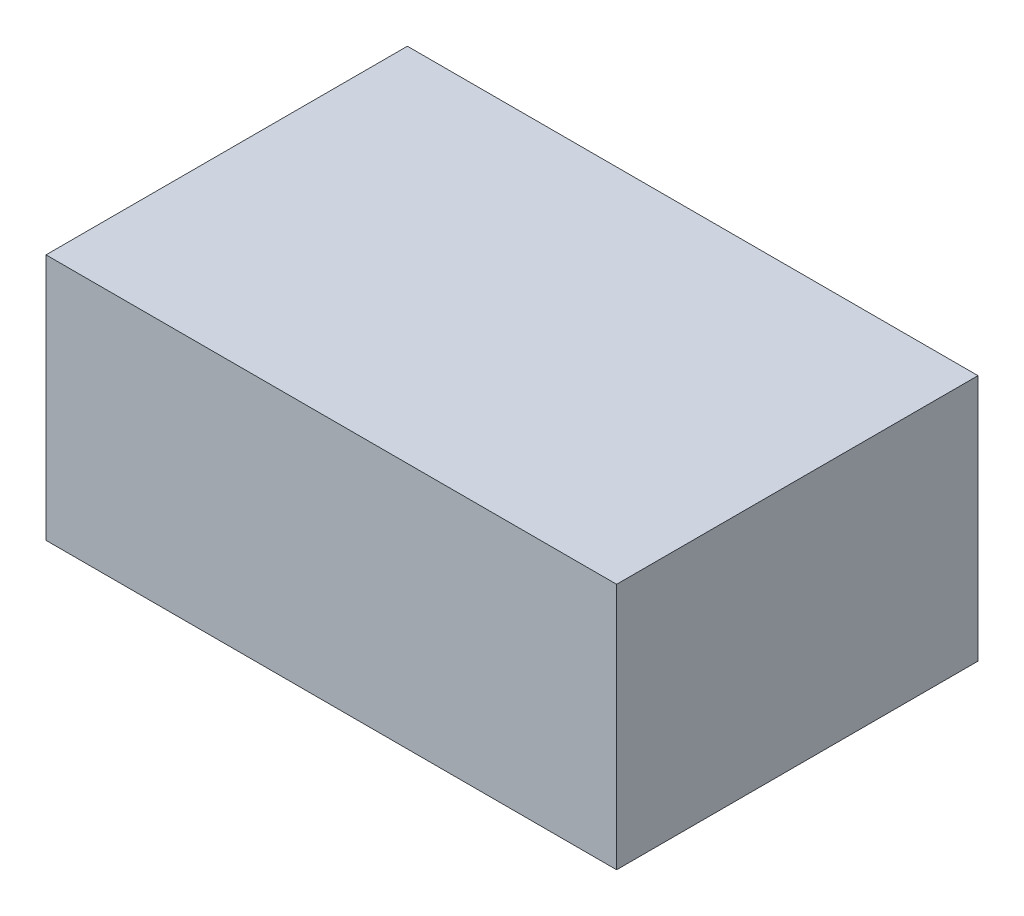
ISO-10303-21;
HEADER;
FILE_DESCRIPTION(('STEP AP214'),'2;1');
FILE_NAME('part.step','',(''),(''),'','','');
FILE_SCHEMA(('AUTOMOTIVE_DESIGN { 1 0 10303 214 1 1 1 1 }'));
ENDSEC;
DATA;
#1=APPLICATION_CONTEXT('core data for automotive mechanical design processes');
#2=APPLICATION_PROTOCOL_DEFINITION('international standard','automotive_design',2000,#1);
#3=PRODUCT_CONTEXT('',#1,'mechanical');
#4=PRODUCT('Part','Part','',(#3));
#5=PRODUCT_RELATED_PRODUCT_CATEGORY('part','',(#4));
#6=PRODUCT_DEFINITION_FORMATION('','',#4);
#7=PRODUCT_DEFINITION_CONTEXT('part definition',#1,'design');
#8=PRODUCT_DEFINITION('design','',#6,#7);
#9=PRODUCT_DEFINITION_SHAPE('','',#8);
#10=(LENGTH_UNIT() NAMED_UNIT(*) SI_UNIT(.MILLI.,.METRE.));
#11=(NAMED_UNIT(*) PLANE_ANGLE_UNIT() SI_UNIT($,.RADIAN.));
#12=(NAMED_UNIT(*) SI_UNIT($,.STERADIAN.) SOLID_ANGLE_UNIT());
#13=UNCERTAINTY_MEASURE_WITH_UNIT(LENGTH_MEASURE(1.E-05),#10,'distance_accuracy_value','');
#14=(GEOMETRIC_REPRESENTATION_CONTEXT(3) GLOBAL_UNCERTAINTY_ASSIGNED_CONTEXT((#13)) GLOBAL_UNIT_ASSIGNED_CONTEXT((#10,
#11,#12)) REPRESENTATION_CONTEXT('',''));
#15=CARTESIAN_POINT('',(0.,0.,0.));
#16=DIRECTION('',(0.,0.,1.));
#17=DIRECTION('',(1.,0.,0.));
#18=AXIS2_PLACEMENT_3D('',#15,#16,#17);
#19=CARTESIAN_POINT('',(-75.,32.5,0.));
#20=DIRECTION('',(0.,0.,1.));
#21=DIRECTION('',(1.,0.,0.));
#22=AXIS2_PLACEMENT_3D('',#19,#20,#21);
#23=PLANE('',#22);
#24=DIRECTION('',(1.,0.,0.));
#25=VECTOR('',#24,1.);
#26=CARTESIAN_POINT('',(-59.,-25.5,0.));
#27=LINE('',#26,#25);
#28=CARTESIAN_POINT('',(-60.,-25.5,0.));
#29=VERTEX_POINT('',#28);
#30=CARTESIAN_POINT('',(-59.,-25.5,0.));
#31=VERTEX_POINT('',#30);
#32=EDGE_CURVE('E165',#29,#31,#27,.T.);
#33=ORIENTED_EDGE('',*,*,#32,.T.);
#34=DIRECTION('',(0.,1.,0.));
#35=VECTOR('',#34,1.);
#36=CARTESIAN_POINT('',(-59.,-25.5,0.));
#37=LINE('',#36,#35);
#38=CARTESIAN_POINT('',(-59.,-18.5,0.));
#39=VERTEX_POINT('',#38);
#40=EDGE_CURVE('E50',#31,#39,#37,.T.);
#41=ORIENTED_EDGE('',*,*,#40,.T.);
#42=DIRECTION('',(-1.,0.,0.));
#43=VECTOR('',#42,1.);
#44=CARTESIAN_POINT('',(-59.,-18.5,0.));
#45=LINE('',#44,#43);
#46=CARTESIAN_POINT('',(-60.,-18.5,0.));
#47=VERTEX_POINT('',#46);
#48=EDGE_CURVE('E171',#39,#47,#45,.T.);
#49=ORIENTED_EDGE('',*,*,#48,.T.);
#50=DIRECTION('',(0.,-1.,0.));
#51=VECTOR('',#50,1.);
#52=CARTESIAN_POINT('',(-60.,-25.5,0.));
#53=LINE('',#52,#51);
#54=EDGE_CURVE('E155',#47,#29,#53,.T.);
#55=ORIENTED_EDGE('',*,*,#54,.T.);
#56=EDGE_LOOP('',(#33,#41,#49,#55));
#57=FACE_BOUND('',#56,.T.);
#58=DIRECTION('',(0.,-1.,0.));
#59=VECTOR('',#58,1.);
#60=CARTESIAN_POINT('',(-75.,32.5,0.));
#61=LINE('',#60,#59);
#62=CARTESIAN_POINT('',(-75.,32.5,0.));
#63=VERTEX_POINT('',#62);
#64=CARTESIAN_POINT('',(-75.,-32.5,0.));
#65=VERTEX_POINT('',#64);
#66=EDGE_CURVE('E202',#63,#65,#61,.T.);
#67=ORIENTED_EDGE('',*,*,#66,.F.);
#68=DIRECTION('',(-1.,0.,0.));
#69=VECTOR('',#68,1.);
#70=CARTESIAN_POINT('',(-75.,32.5,0.));
#71=LINE('',#70,#69);
#72=CARTESIAN_POINT('',(75.,32.5,0.));
#73=VERTEX_POINT('',#72);
#74=EDGE_CURVE('E254',#73,#63,#71,.T.);
#75=ORIENTED_EDGE('',*,*,#74,.F.);
#76=DIRECTION('',(0.,1.,0.));
#77=VECTOR('',#76,1.);
#78=CARTESIAN_POINT('',(75.,32.5,0.));
#79=LINE('',#78,#77);
#80=CARTESIAN_POINT('',(75.,-32.5,0.));
#81=VERTEX_POINT('',#80);
#82=EDGE_CURVE('E265',#81,#73,#79,.T.);
#83=ORIENTED_EDGE('',*,*,#82,.F.);
#84=DIRECTION('',(1.,0.,0.));
#85=VECTOR('',#84,1.);
#86=CARTESIAN_POINT('',(-75.,-32.5,0.));
#87=LINE('',#86,#85);
#88=EDGE_CURVE('E263',#65,#81,#87,.T.);
#89=ORIENTED_EDGE('',*,*,#88,.F.);
#90=EDGE_LOOP('',(#67,#75,#83,#89));
#91=FACE_BOUND('',#90,.T.);
#92=DIRECTION('',(1.,0.,0.));
#93=VECTOR('',#92,1.);
#94=CARTESIAN_POINT('',(-59.,25.5,0.));
#95=LINE('',#94,#93);
#96=CARTESIAN_POINT('',(-60.,25.5,0.));
#97=VERTEX_POINT('',#96);
#98=CARTESIAN_POINT('',(-59.,25.5,0.));
#99=VERTEX_POINT('',#98);
#100=EDGE_CURVE('E58',#97,#99,#95,.T.);
#101=ORIENTED_EDGE('',*,*,#100,.F.);
#102=DIRECTION('',(0.,1.,0.));
#103=VECTOR('',#102,1.);
#104=CARTESIAN_POINT('',(-60.,25.5,0.));
#105=LINE('',#104,#103);
#106=CARTESIAN_POINT('',(-60.,18.5,0.));
#107=VERTEX_POINT('',#106);
#108=EDGE_CURVE('E220',#107,#97,#105,.T.);
#109=ORIENTED_EDGE('',*,*,#108,.F.);
#110=DIRECTION('',(-1.,0.,0.));
#111=VECTOR('',#110,1.);
#112=CARTESIAN_POINT('',(-59.,18.5,0.));
#113=LINE('',#112,#111);
#114=CARTESIAN_POINT('',(-59.,18.5,0.));
#115=VERTEX_POINT('',#114);
#116=EDGE_CURVE('E217',#115,#107,#113,.T.);
#117=ORIENTED_EDGE('',*,*,#116,.F.);
#118=DIRECTION('',(0.,-1.,0.));
#119=VECTOR('',#118,1.);
#120=CARTESIAN_POINT('',(-59.,25.5,0.));
#121=LINE('',#120,#119);
#122=EDGE_CURVE('E197',#99,#115,#121,.T.);
#123=ORIENTED_EDGE('',*,*,#122,.F.);
#124=EDGE_LOOP('',(#101,#109,#117,#123));
#125=FACE_BOUND('',#124,.T.);
#126=ADVANCED_FACE('F35',(#57,#91,#125),#23,.F.);
#127=CARTESIAN_POINT('',(-75.,32.5,95.));
#128=DIRECTION('',(1.,0.,0.));
#129=DIRECTION('',(0.,0.,-1.));
#130=AXIS2_PLACEMENT_3D('',#127,#128,#129);
#131=PLANE('',#130);
#132=ORIENTED_EDGE('',*,*,#66,.T.);
#133=DIRECTION('',(0.,0.,-1.));
#134=VECTOR('',#133,1.);
#135=CARTESIAN_POINT('',(-75.,-32.5,95.));
#136=LINE('',#135,#134);
#137=CARTESIAN_POINT('',(-75.,-32.5,95.));
#138=VERTEX_POINT('',#137);
#139=EDGE_CURVE('E12',#138,#65,#136,.T.);
#140=ORIENTED_EDGE('',*,*,#139,.F.);
#141=DIRECTION('',(0.,-1.,0.));
#142=VECTOR('',#141,1.);
#143=CARTESIAN_POINT('',(-75.,32.5,95.));
#144=LINE('',#143,#142);
#145=CARTESIAN_POINT('',(-75.,32.5,95.));
#146=VERTEX_POINT('',#145);
#147=EDGE_CURVE('E250',#146,#138,#144,.T.);
#148=ORIENTED_EDGE('',*,*,#147,.F.);
#149=DIRECTION('',(0.,0.,-1.));
#150=VECTOR('',#149,1.);
#151=CARTESIAN_POINT('',(-75.,32.5,95.));
#152=LINE('',#151,#150);
#153=EDGE_CURVE('E260',#146,#63,#152,.T.);
#154=ORIENTED_EDGE('',*,*,#153,.T.);
#155=EDGE_LOOP('',(#132,#140,#148,#154));
#156=FACE_BOUND('',#155,.T.);
#157=ADVANCED_FACE('F37',(#156),#131,.F.);
#158=CARTESIAN_POINT('',(-75.,-32.5,95.));
#159=DIRECTION('',(0.,1.,0.));
#160=DIRECTION('',(-1.,0.,0.));
#161=AXIS2_PLACEMENT_3D('',#158,#159,#160);
#162=PLANE('',#161);
#163=ORIENTED_EDGE('',*,*,#88,.T.);
#164=DIRECTION('',(0.,0.,-1.));
#165=VECTOR('',#164,1.);
#166=CARTESIAN_POINT('',(75.,-32.5,95.));
#167=LINE('',#166,#165);
#168=CARTESIAN_POINT('',(75.,-32.5,95.));
#169=VERTEX_POINT('',#168);
#170=EDGE_CURVE('E43',#169,#81,#167,.T.);
#171=ORIENTED_EDGE('',*,*,#170,.F.);
#172=DIRECTION('',(1.,0.,0.));
#173=VECTOR('',#172,1.);
#174=CARTESIAN_POINT('',(-75.,-32.5,95.));
#175=LINE('',#174,#173);
#176=EDGE_CURVE('E253',#138,#169,#175,.T.);
#177=ORIENTED_EDGE('',*,*,#176,.F.);
#178=ORIENTED_EDGE('',*,*,#139,.T.);
#179=EDGE_LOOP('',(#163,#171,#177,#178));
#180=FACE_BOUND('',#179,.T.);
#181=ADVANCED_FACE('F291',(#180),#162,.F.);
#182=CARTESIAN_POINT('',(75.,32.5,95.));
#183=DIRECTION('',(-1.,0.,0.));
#184=DIRECTION('',(0.,-1.,0.));
#185=AXIS2_PLACEMENT_3D('',#182,#183,#184);
#186=PLANE('',#185);
#187=ORIENTED_EDGE('',*,*,#82,.T.);
#188=DIRECTION('',(0.,0.,-1.));
#189=VECTOR('',#188,1.);
#190=CARTESIAN_POINT('',(75.,32.5,95.));
#191=LINE('',#190,#189);
#192=CARTESIAN_POINT('',(75.,32.5,95.));
#193=VERTEX_POINT('',#192);
#194=EDGE_CURVE('E270',#193,#73,#191,.T.);
#195=ORIENTED_EDGE('',*,*,#194,.F.);
#196=DIRECTION('',(0.,1.,0.));
#197=VECTOR('',#196,1.);
#198=CARTESIAN_POINT('',(75.,32.5,95.));
#199=LINE('',#198,#197);
#200=EDGE_CURVE('E256',#169,#193,#199,.T.);
#201=ORIENTED_EDGE('',*,*,#200,.F.);
#202=ORIENTED_EDGE('',*,*,#170,.T.);
#203=EDGE_LOOP('',(#187,#195,#201,#202));
#204=FACE_BOUND('',#203,.T.);
#205=ADVANCED_FACE('F277',(#204),#186,.F.);
#206=CARTESIAN_POINT('',(-75.,32.5,95.));
#207=DIRECTION('',(0.,-1.,0.));
#208=DIRECTION('',(1.,0.,0.));
#209=AXIS2_PLACEMENT_3D('',#206,#207,#208);
#210=PLANE('',#209);
#211=ORIENTED_EDGE('',*,*,#74,.T.);
#212=ORIENTED_EDGE('',*,*,#153,.F.);
#213=DIRECTION('',(-1.,0.,0.));
#214=VECTOR('',#213,1.);
#215=CARTESIAN_POINT('',(-75.,32.5,95.));
#216=LINE('',#215,#214);
#217=EDGE_CURVE('E258',#193,#146,#216,.T.);
#218=ORIENTED_EDGE('',*,*,#217,.F.);
#219=ORIENTED_EDGE('',*,*,#194,.T.);
#220=EDGE_LOOP('',(#211,#212,#218,#219));
#221=FACE_BOUND('',#220,.T.);
#222=ADVANCED_FACE('F284',(#221),#210,.F.);
#223=CARTESIAN_POINT('',(-75.,32.5,95.));
#224=DIRECTION('',(0.,0.,1.));
#225=DIRECTION('',(1.,0.,0.));
#226=AXIS2_PLACEMENT_3D('',#223,#224,#225);
#227=PLANE('',#226);
#228=ORIENTED_EDGE('',*,*,#147,.T.);
#229=ORIENTED_EDGE('',*,*,#176,.T.);
#230=ORIENTED_EDGE('',*,*,#200,.T.);
#231=ORIENTED_EDGE('',*,*,#217,.T.);
#232=EDGE_LOOP('',(#228,#229,#230,#231));
#233=FACE_BOUND('',#232,.T.);
#234=ADVANCED_FACE('F290',(#233),#227,.T.);
#235=CARTESIAN_POINT('',(-60.,25.5,-4.5));
#236=DIRECTION('',(0.,0.,-1.));
#237=DIRECTION('',(-1.,0.,0.));
#238=AXIS2_PLACEMENT_3D('',#235,#236,#237);
#239=PLANE('',#238);
#240=DIRECTION('',(1.,0.,0.));
#241=VECTOR('',#240,1.);
#242=CARTESIAN_POINT('',(-60.,25.5,-4.5));
#243=LINE('',#242,#241);
#244=CARTESIAN_POINT('',(-60.,25.5,-4.5));
#245=VERTEX_POINT('',#244);
#246=CARTESIAN_POINT('',(-48.5,25.5,-4.5));
#247=VERTEX_POINT('',#246);
#248=EDGE_CURVE('E236',#245,#247,#243,.T.);
#249=ORIENTED_EDGE('',*,*,#248,.T.);
#250=DIRECTION('',(0.,-1.,0.));
#251=VECTOR('',#250,1.);
#252=CARTESIAN_POINT('',(-48.5,25.5,-4.5));
#253=LINE('',#252,#251);
#254=CARTESIAN_POINT('',(-48.5,18.5,-4.5));
#255=VERTEX_POINT('',#254);
#256=EDGE_CURVE('E203',#247,#255,#253,.T.);
#257=ORIENTED_EDGE('',*,*,#256,.T.);
#258=DIRECTION('',(1.,0.,0.));
#259=VECTOR('',#258,1.);
#260=CARTESIAN_POINT('',(-60.,18.5,-4.5));
#261=LINE('',#260,#259);
#262=CARTESIAN_POINT('',(-60.,18.5,-4.5));
#263=VERTEX_POINT('',#262);
#264=EDGE_CURVE('E239',#263,#255,#261,.T.);
#265=ORIENTED_EDGE('',*,*,#264,.F.);
#266=DIRECTION('',(0.,1.,0.));
#267=VECTOR('',#266,1.);
#268=CARTESIAN_POINT('',(-60.,25.5,-4.5));
#269=LINE('',#268,#267);
#270=EDGE_CURVE('E210',#263,#245,#269,.T.);
#271=ORIENTED_EDGE('',*,*,#270,.T.);
#272=EDGE_LOOP('',(#249,#257,#265,#271));
#273=FACE_BOUND('',#272,.T.);
#274=ADVANCED_FACE('F309',(#273),#239,.T.);
#275=CARTESIAN_POINT('',(-59.,25.5,-3.5));
#276=DIRECTION('',(0.,0.,1.));
#277=DIRECTION('',(1.,0.,0.));
#278=AXIS2_PLACEMENT_3D('',#275,#276,#277);
#279=PLANE('',#278);
#280=DIRECTION('',(1.,0.,0.));
#281=VECTOR('',#280,1.);
#282=CARTESIAN_POINT('',(-59.,18.5,-3.5));
#283=LINE('',#282,#281);
#284=CARTESIAN_POINT('',(-59.,18.5,-3.5));
#285=VERTEX_POINT('',#284);
#286=CARTESIAN_POINT('',(-48.5,18.5,-3.5));
#287=VERTEX_POINT('',#286);
#288=EDGE_CURVE('E242',#285,#287,#283,.T.);
#289=ORIENTED_EDGE('',*,*,#288,.T.);
#290=DIRECTION('',(0.,1.,0.));
#291=VECTOR('',#290,1.);
#292=CARTESIAN_POINT('',(-48.5,25.5,-3.5));
#293=LINE('',#292,#291);
#294=CARTESIAN_POINT('',(-48.5,25.5,-3.5));
#295=VERTEX_POINT('',#294);
#296=EDGE_CURVE('E209',#287,#295,#293,.T.);
#297=ORIENTED_EDGE('',*,*,#296,.T.);
#298=DIRECTION('',(1.,0.,0.));
#299=VECTOR('',#298,1.);
#300=CARTESIAN_POINT('',(-59.,25.5,-3.5));
#301=LINE('',#300,#299);
#302=CARTESIAN_POINT('',(-59.,25.5,-3.5));
#303=VERTEX_POINT('',#302);
#304=EDGE_CURVE('E245',#303,#295,#301,.T.);
#305=ORIENTED_EDGE('',*,*,#304,.F.);
#306=DIRECTION('',(0.,-1.,0.));
#307=VECTOR('',#306,1.);
#308=CARTESIAN_POINT('',(-59.,25.5,-3.5));
#309=LINE('',#308,#307);
#310=EDGE_CURVE('E213',#303,#285,#309,.T.);
#311=ORIENTED_EDGE('',*,*,#310,.T.);
#312=EDGE_LOOP('',(#289,#297,#305,#311));
#313=FACE_BOUND('',#312,.T.);
#314=ADVANCED_FACE('F313',(#313),#279,.T.);
#315=CARTESIAN_POINT('',(-59.,25.5,-11.0710678118655));
#316=DIRECTION('',(0.,-1.,0.));
#317=DIRECTION('',(0.,0.,-1.));
#318=AXIS2_PLACEMENT_3D('',#315,#316,#317);
#319=PLANE('',#318);
#320=DIRECTION('',(0.,0.,1.));
#321=VECTOR('',#320,1.);
#322=CARTESIAN_POINT('',(-59.,25.5,-11.0710678118655));
#323=LINE('',#322,#321);
#324=EDGE_CURVE('E224',#303,#99,#323,.T.);
#325=ORIENTED_EDGE('',*,*,#324,.F.);
#326=ORIENTED_EDGE('',*,*,#304,.T.);
#327=DIRECTION('',(0.,0.,-1.));
#328=VECTOR('',#327,1.);
#329=CARTESIAN_POINT('',(-48.5,25.5,-7.28553390593274));
#330=LINE('',#329,#328);
#331=EDGE_CURVE('E206',#295,#247,#330,.T.);
#332=ORIENTED_EDGE('',*,*,#331,.T.);
#333=ORIENTED_EDGE('',*,*,#248,.F.);
#334=DIRECTION('',(0.,0.,1.));
#335=VECTOR('',#334,1.);
#336=CARTESIAN_POINT('',(-60.,25.5,-11.0710678118655));
#337=LINE('',#336,#335);
#338=EDGE_CURVE('E227',#245,#97,#337,.T.);
#339=ORIENTED_EDGE('',*,*,#338,.T.);
#340=ORIENTED_EDGE('',*,*,#100,.T.);
#341=EDGE_LOOP('',(#325,#326,#332,#333,#339,#340));
#342=FACE_BOUND('',#341,.T.);
#343=ADVANCED_FACE('F319',(#342),#319,.F.);
#344=CARTESIAN_POINT('',(-60.,25.5,-11.0710678118655));
#345=DIRECTION('',(1.,0.,0.));
#346=DIRECTION('',(0.,0.,-1.));
#347=AXIS2_PLACEMENT_3D('',#344,#345,#346);
#348=PLANE('',#347);
#349=ORIENTED_EDGE('',*,*,#270,.F.);
#350=DIRECTION('',(0.,0.,1.));
#351=VECTOR('',#350,1.);
#352=CARTESIAN_POINT('',(-60.,18.5,-11.0710678118655));
#353=LINE('',#352,#351);
#354=EDGE_CURVE('E229',#263,#107,#353,.T.);
#355=ORIENTED_EDGE('',*,*,#354,.T.);
#356=ORIENTED_EDGE('',*,*,#108,.T.);
#357=ORIENTED_EDGE('',*,*,#338,.F.);
#358=EDGE_LOOP('',(#349,#355,#356,#357));
#359=FACE_BOUND('',#358,.T.);
#360=ADVANCED_FACE('F330',(#359),#348,.F.);
#361=CARTESIAN_POINT('',(-59.,18.5,-11.0710678118655));
#362=DIRECTION('',(0.,1.,0.));
#363=DIRECTION('',(0.,0.,1.));
#364=AXIS2_PLACEMENT_3D('',#361,#362,#363);
#365=PLANE('',#364);
#366=ORIENTED_EDGE('',*,*,#354,.F.);
#367=ORIENTED_EDGE('',*,*,#264,.T.);
#368=DIRECTION('',(0.,0.,1.));
#369=VECTOR('',#368,1.);
#370=CARTESIAN_POINT('',(-48.5,18.5,-7.28553390593274));
#371=LINE('',#370,#369);
#372=EDGE_CURVE('E199',#255,#287,#371,.T.);
#373=ORIENTED_EDGE('',*,*,#372,.T.);
#374=ORIENTED_EDGE('',*,*,#288,.F.);
#375=DIRECTION('',(0.,0.,1.));
#376=VECTOR('',#375,1.);
#377=CARTESIAN_POINT('',(-59.,18.5,-11.0710678118655));
#378=LINE('',#377,#376);
#379=EDGE_CURVE('E214',#285,#115,#378,.T.);
#380=ORIENTED_EDGE('',*,*,#379,.T.);
#381=ORIENTED_EDGE('',*,*,#116,.T.);
#382=EDGE_LOOP('',(#366,#367,#373,#374,#380,#381));
#383=FACE_BOUND('',#382,.T.);
#384=ADVANCED_FACE('F326',(#383),#365,.F.);
#385=CARTESIAN_POINT('',(-59.,25.5,-11.0710678118655));
#386=DIRECTION('',(-1.,0.,0.));
#387=DIRECTION('',(0.,0.,1.));
#388=AXIS2_PLACEMENT_3D('',#385,#386,#387);
#389=PLANE('',#388);
#390=ORIENTED_EDGE('',*,*,#310,.F.);
#391=ORIENTED_EDGE('',*,*,#324,.T.);
#392=ORIENTED_EDGE('',*,*,#122,.T.);
#393=ORIENTED_EDGE('',*,*,#379,.F.);
#394=EDGE_LOOP('',(#390,#391,#392,#393));
#395=FACE_BOUND('',#394,.T.);
#396=ADVANCED_FACE('F322',(#395),#389,.F.);
#397=CARTESIAN_POINT('',(-48.5,22.,-4.));
#398=DIRECTION('',(1.,0.,0.));
#399=DIRECTION('',(0.,0.,-1.));
#400=AXIS2_PLACEMENT_3D('',#397,#398,#399);
#401=PLANE('',#400);
#402=ORIENTED_EDGE('',*,*,#296,.F.);
#403=ORIENTED_EDGE('',*,*,#372,.F.);
#404=ORIENTED_EDGE('',*,*,#256,.F.);
#405=ORIENTED_EDGE('',*,*,#331,.F.);
#406=EDGE_LOOP('',(#402,#403,#404,#405));
#407=FACE_BOUND('',#406,.T.);
#408=ADVANCED_FACE('F325',(#407),#401,.T.);
#409=CARTESIAN_POINT('',(-60.,-25.5,-4.5));
#410=DIRECTION('',(0.,0.,1.));
#411=DIRECTION('',(1.,0.,0.));
#412=AXIS2_PLACEMENT_3D('',#409,#410,#411);
#413=PLANE('',#412);
#414=DIRECTION('',(0.,1.,0.));
#415=VECTOR('',#414,1.);
#416=CARTESIAN_POINT('',(-48.5,-25.5,-4.5));
#417=LINE('',#416,#415);
#418=CARTESIAN_POINT('',(-48.5,-25.5,-4.5));
#419=VERTEX_POINT('',#418);
#420=CARTESIAN_POINT('',(-48.5,-18.5,-4.5));
#421=VERTEX_POINT('',#420);
#422=EDGE_CURVE('E198',#419,#421,#417,.T.);
#423=ORIENTED_EDGE('',*,*,#422,.F.);
#424=DIRECTION('',(1.,0.,0.));
#425=VECTOR('',#424,1.);
#426=CARTESIAN_POINT('',(-60.,-25.5,-4.5));
#427=LINE('',#426,#425);
#428=CARTESIAN_POINT('',(-60.,-25.5,-4.5));
#429=VERTEX_POINT('',#428);
#430=EDGE_CURVE('E183',#429,#419,#427,.T.);
#431=ORIENTED_EDGE('',*,*,#430,.F.);
#432=DIRECTION('',(0.,-1.,0.));
#433=VECTOR('',#432,1.);
#434=CARTESIAN_POINT('',(-60.,-25.5,-4.5));
#435=LINE('',#434,#433);
#436=CARTESIAN_POINT('',(-60.,-18.5,-4.5));
#437=VERTEX_POINT('',#436);
#438=EDGE_CURVE('E158',#437,#429,#435,.T.);
#439=ORIENTED_EDGE('',*,*,#438,.F.);
#440=DIRECTION('',(1.,0.,0.));
#441=VECTOR('',#440,1.);
#442=CARTESIAN_POINT('',(-60.,-18.5,-4.5));
#443=LINE('',#442,#441);
#444=EDGE_CURVE('E191',#437,#421,#443,.T.);
#445=ORIENTED_EDGE('',*,*,#444,.T.);
#446=EDGE_LOOP('',(#423,#431,#439,#445));
#447=FACE_BOUND('',#446,.T.);
#448=ADVANCED_FACE('F340',(#447),#413,.F.);
#449=CARTESIAN_POINT('',(-59.,-25.5,-3.5));
#450=DIRECTION('',(0.,0.,-1.));
#451=DIRECTION('',(-1.,0.,0.));
#452=AXIS2_PLACEMENT_3D('',#449,#450,#451);
#453=PLANE('',#452);
#454=DIRECTION('',(0.,-1.,0.));
#455=VECTOR('',#454,1.);
#456=CARTESIAN_POINT('',(-48.5,-25.5,-3.5));
#457=LINE('',#456,#455);
#458=CARTESIAN_POINT('',(-48.5,-18.5,-3.5));
#459=VERTEX_POINT('',#458);
#460=CARTESIAN_POINT('',(-48.5,-25.5,-3.5));
#461=VERTEX_POINT('',#460);
#462=EDGE_CURVE('E194',#459,#461,#457,.T.);
#463=ORIENTED_EDGE('',*,*,#462,.F.);
#464=DIRECTION('',(1.,0.,0.));
#465=VECTOR('',#464,1.);
#466=CARTESIAN_POINT('',(-59.,-18.5,-3.5));
#467=LINE('',#466,#465);
#468=CARTESIAN_POINT('',(-59.,-18.5,-3.5));
#469=VERTEX_POINT('',#468);
#470=EDGE_CURVE('E188',#469,#459,#467,.T.);
#471=ORIENTED_EDGE('',*,*,#470,.F.);
#472=DIRECTION('',(0.,1.,0.));
#473=VECTOR('',#472,1.);
#474=CARTESIAN_POINT('',(-59.,-25.5,-3.5));
#475=LINE('',#474,#473);
#476=CARTESIAN_POINT('',(-59.,-25.5,-3.5));
#477=VERTEX_POINT('',#476);
#478=EDGE_CURVE('E180',#477,#469,#475,.T.);
#479=ORIENTED_EDGE('',*,*,#478,.F.);
#480=DIRECTION('',(1.,0.,0.));
#481=VECTOR('',#480,1.);
#482=CARTESIAN_POINT('',(-59.,-25.5,-3.5));
#483=LINE('',#482,#481);
#484=EDGE_CURVE('E185',#477,#461,#483,.T.);
#485=ORIENTED_EDGE('',*,*,#484,.T.);
#486=EDGE_LOOP('',(#463,#471,#479,#485));
#487=FACE_BOUND('',#486,.T.);
#488=ADVANCED_FACE('F342',(#487),#453,.F.);
#489=CARTESIAN_POINT('',(-59.,-25.5,-11.0710678118655));
#490=DIRECTION('',(1.,0.,0.));
#491=DIRECTION('',(0.,0.,-1.));
#492=AXIS2_PLACEMENT_3D('',#489,#490,#491);
#493=PLANE('',#492);
#494=DIRECTION('',(0.,0.,1.));
#495=VECTOR('',#494,1.);
#496=CARTESIAN_POINT('',(-59.,-25.5,-11.0710678118655));
#497=LINE('',#496,#495);
#498=EDGE_CURVE('E161',#477,#31,#497,.T.);
#499=ORIENTED_EDGE('',*,*,#498,.F.);
#500=ORIENTED_EDGE('',*,*,#478,.T.);
#501=DIRECTION('',(0.,0.,1.));
#502=VECTOR('',#501,1.);
#503=CARTESIAN_POINT('',(-59.,-18.5,-11.0710678118655));
#504=LINE('',#503,#502);
#505=EDGE_CURVE('E173',#469,#39,#504,.T.);
#506=ORIENTED_EDGE('',*,*,#505,.T.);
#507=ORIENTED_EDGE('',*,*,#40,.F.);
#508=EDGE_LOOP('',(#499,#500,#506,#507));
#509=FACE_BOUND('',#508,.T.);
#510=ADVANCED_FACE('F345',(#509),#493,.T.);
#511=CARTESIAN_POINT('',(-59.,-18.5,-11.0710678118655));
#512=DIRECTION('',(0.,1.,0.));
#513=DIRECTION('',(0.,0.,1.));
#514=AXIS2_PLACEMENT_3D('',#511,#512,#513);
#515=PLANE('',#514);
#516=ORIENTED_EDGE('',*,*,#505,.F.);
#517=ORIENTED_EDGE('',*,*,#470,.T.);
#518=DIRECTION('',(0.,0.,1.));
#519=VECTOR('',#518,1.);
#520=CARTESIAN_POINT('',(-48.5,-18.5,-7.28553390593274));
#521=LINE('',#520,#519);
#522=EDGE_CURVE('E195',#421,#459,#521,.T.);
#523=ORIENTED_EDGE('',*,*,#522,.F.);
#524=ORIENTED_EDGE('',*,*,#444,.F.);
#525=DIRECTION('',(0.,0.,1.));
#526=VECTOR('',#525,1.);
#527=CARTESIAN_POINT('',(-60.,-18.5,-11.0710678118655));
#528=LINE('',#527,#526);
#529=EDGE_CURVE('E162',#437,#47,#528,.T.);
#530=ORIENTED_EDGE('',*,*,#529,.T.);
#531=ORIENTED_EDGE('',*,*,#48,.F.);
#532=EDGE_LOOP('',(#516,#517,#523,#524,#530,#531));
#533=FACE_BOUND('',#532,.T.);
#534=ADVANCED_FACE('F352',(#533),#515,.T.);
#535=CARTESIAN_POINT('',(-60.,-25.5,-11.0710678118655));
#536=DIRECTION('',(-1.,0.,0.));
#537=DIRECTION('',(0.,0.,1.));
#538=AXIS2_PLACEMENT_3D('',#535,#536,#537);
#539=PLANE('',#538);
#540=ORIENTED_EDGE('',*,*,#529,.F.);
#541=ORIENTED_EDGE('',*,*,#438,.T.);
#542=DIRECTION('',(0.,0.,1.));
#543=VECTOR('',#542,1.);
#544=CARTESIAN_POINT('',(-60.,-25.5,-11.0710678118655));
#545=LINE('',#544,#543);
#546=EDGE_CURVE('E150',#429,#29,#545,.T.);
#547=ORIENTED_EDGE('',*,*,#546,.T.);
#548=ORIENTED_EDGE('',*,*,#54,.F.);
#549=EDGE_LOOP('',(#540,#541,#547,#548));
#550=FACE_BOUND('',#549,.T.);
#551=ADVANCED_FACE('F153',(#550),#539,.T.);
#552=CARTESIAN_POINT('',(-59.,-25.5,-11.0710678118655));
#553=DIRECTION('',(0.,-1.,0.));
#554=DIRECTION('',(0.,0.,-1.));
#555=AXIS2_PLACEMENT_3D('',#552,#553,#554);
#556=PLANE('',#555);
#557=ORIENTED_EDGE('',*,*,#546,.F.);
#558=ORIENTED_EDGE('',*,*,#430,.T.);
#559=DIRECTION('',(0.,0.,-1.));
#560=VECTOR('',#559,1.);
#561=CARTESIAN_POINT('',(-48.5,-25.5,-7.28553390593274));
#562=LINE('',#561,#560);
#563=EDGE_CURVE('E369',#461,#419,#562,.T.);
#564=ORIENTED_EDGE('',*,*,#563,.F.);
#565=ORIENTED_EDGE('',*,*,#484,.F.);
#566=ORIENTED_EDGE('',*,*,#498,.T.);
#567=ORIENTED_EDGE('',*,*,#32,.F.);
#568=EDGE_LOOP('',(#557,#558,#564,#565,#566,#567));
#569=FACE_BOUND('',#568,.T.);
#570=ADVANCED_FACE('F166',(#569),#556,.T.);
#571=CARTESIAN_POINT('',(-48.5,-22.,-4.));
#572=DIRECTION('',(1.,0.,0.));
#573=DIRECTION('',(0.,0.,-1.));
#574=AXIS2_PLACEMENT_3D('',#571,#572,#573);
#575=PLANE('',#574);
#576=ORIENTED_EDGE('',*,*,#422,.T.);
#577=ORIENTED_EDGE('',*,*,#522,.T.);
#578=ORIENTED_EDGE('',*,*,#462,.T.);
#579=ORIENTED_EDGE('',*,*,#563,.T.);
#580=EDGE_LOOP('',(#576,#577,#578,#579));
#581=FACE_BOUND('',#580,.T.);
#582=ADVANCED_FACE('F355',(#581),#575,.T.);
#583=CLOSED_SHELL('',(#126,#157,#181,#205,#222,#234,#274,#314,#343,#360,#384,#396,#408,#448,
#488,#510,#534,#551,#570,#582));
#584=MANIFOLD_SOLID_BREP('B2',#583);
#585=ADVANCED_BREP_SHAPE_REPRESENTATION('',(#18,#584),#14);
#586=SHAPE_DEFINITION_REPRESENTATION(#9,#585);
ENDSEC;
END-ISO-10303-21;
